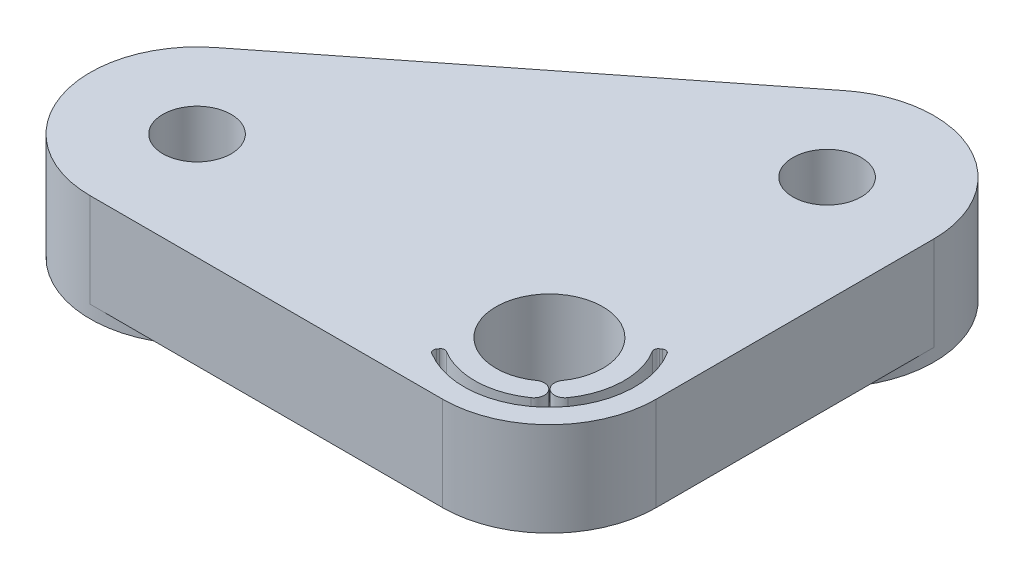
ISO-10303-21;
HEADER;
FILE_DESCRIPTION(('STEP AP214'),'2;1');
FILE_NAME('part.step','',(''),(''),'','','');
FILE_SCHEMA(('AUTOMOTIVE_DESIGN { 1 0 10303 214 1 1 1 1 }'));
ENDSEC;
DATA;
#1=APPLICATION_CONTEXT('core data for automotive mechanical design processes');
#2=APPLICATION_PROTOCOL_DEFINITION('international standard','automotive_design',2000,#1);
#3=PRODUCT_CONTEXT('',#1,'mechanical');
#4=PRODUCT('Part','Part','',(#3));
#5=PRODUCT_RELATED_PRODUCT_CATEGORY('part','',(#4));
#6=PRODUCT_DEFINITION_FORMATION('','',#4);
#7=PRODUCT_DEFINITION_CONTEXT('part definition',#1,'design');
#8=PRODUCT_DEFINITION('design','',#6,#7);
#9=PRODUCT_DEFINITION_SHAPE('','',#8);
#10=(LENGTH_UNIT() NAMED_UNIT(*) SI_UNIT(.MILLI.,.METRE.));
#11=(NAMED_UNIT(*) PLANE_ANGLE_UNIT() SI_UNIT($,.RADIAN.));
#12=(NAMED_UNIT(*) SI_UNIT($,.STERADIAN.) SOLID_ANGLE_UNIT());
#13=UNCERTAINTY_MEASURE_WITH_UNIT(LENGTH_MEASURE(1.E-05),#10,'distance_accuracy_value','');
#14=(GEOMETRIC_REPRESENTATION_CONTEXT(3) GLOBAL_UNCERTAINTY_ASSIGNED_CONTEXT((#13)) GLOBAL_UNIT_ASSIGNED_CONTEXT((#10,
#11,#12)) REPRESENTATION_CONTEXT('',''));
#15=CARTESIAN_POINT('',(0.,0.,0.));
#16=DIRECTION('',(0.,0.,1.));
#17=DIRECTION('',(1.,0.,0.));
#18=AXIS2_PLACEMENT_3D('',#15,#16,#17);
#19=CARTESIAN_POINT('',(-10.,0.,0.));
#20=DIRECTION('',(0.,1.,0.));
#21=DIRECTION('',(0.,0.,1.));
#22=AXIS2_PLACEMENT_3D('',#19,#20,#21);
#23=PLANE('',#22);
#24=CARTESIAN_POINT('',(-10.,0.,-13.));
#25=DIRECTION('',(0.,1.,0.));
#26=DIRECTION('',(0.,0.,-1.));
#27=AXIS2_PLACEMENT_3D('',#24,#25,#26);
#28=CIRCLE('',#27,4.99999999999996);
#29=CARTESIAN_POINT('',(-13.0943611330175,0.,-16.9274583611376));
#30=VERTEX_POINT('',#29);
#31=CARTESIAN_POINT('',(-5.,0.,-13.));
#32=VERTEX_POINT('',#31);
#33=EDGE_CURVE('E263',#30,#32,#28,.T.);
#34=ORIENTED_EDGE('',*,*,#33,.T.);
#35=DIRECTION('',(0.,0.,1.));
#36=VECTOR('',#35,1.);
#37=CARTESIAN_POINT('',(-5.,0.,-23.3048337992727));
#38=LINE('',#37,#36);
#39=CARTESIAN_POINT('',(-5.,0.,0.));
#40=VERTEX_POINT('',#39);
#41=EDGE_CURVE('E302',#32,#40,#38,.T.);
#42=ORIENTED_EDGE('',*,*,#41,.T.);
#43=CARTESIAN_POINT('',(-10.,0.,0.));
#44=DIRECTION('',(0.,-1.,0.));
#45=DIRECTION('',(0.,0.,1.));
#46=AXIS2_PLACEMENT_3D('',#43,#44,#45);
#47=CIRCLE('',#46,5.);
#48=CARTESIAN_POINT('',(-10.,0.,5.));
#49=VERTEX_POINT('',#48);
#50=EDGE_CURVE('E315',#49,#40,#47,.F.);
#51=ORIENTED_EDGE('',*,*,#50,.F.);
#52=DIRECTION('',(-1.,0.,0.));
#53=VECTOR('',#52,1.);
#54=CARTESIAN_POINT('',(-5.,0.,5.));
#55=LINE('',#54,#53);
#56=CARTESIAN_POINT('',(-26.5,0.,5.));
#57=VERTEX_POINT('',#56);
#58=EDGE_CURVE('E305',#49,#57,#55,.T.);
#59=ORIENTED_EDGE('',*,*,#58,.T.);
#60=CARTESIAN_POINT('',(-26.5,0.,0.));
#61=DIRECTION('',(0.,1.,0.));
#62=DIRECTION('',(0.,0.,-1.));
#63=AXIS2_PLACEMENT_3D('',#60,#61,#62);
#64=CIRCLE('',#63,5.00000000000015);
#65=CARTESIAN_POINT('',(-29.5943611330177,0.,-3.92745836113779));
#66=VERTEX_POINT('',#65);
#67=EDGE_CURVE('E11',#57,#66,#64,.T.);
#68=ORIENTED_EDGE('',*,*,#67,.T.);
#69=DIRECTION('',(0.785491672227536,0.,-0.618872226603513));
#70=VECTOR('',#69,1.);
#71=CARTESIAN_POINT('',(-40.925365976,0.,5.));
#72=LINE('',#71,#70);
#73=EDGE_CURVE('E308',#66,#30,#72,.T.);
#74=ORIENTED_EDGE('',*,*,#73,.T.);
#75=EDGE_LOOP('',(#34,#42,#51,#59,#68,#74));
#76=FACE_BOUND('',#75,.T.);
#77=CARTESIAN_POINT('',(-10.,0.,0.));
#78=DIRECTION('',(0.,-1.,0.));
#79=DIRECTION('',(0.,0.,1.));
#80=AXIS2_PLACEMENT_3D('',#77,#78,#79);
#81=CIRCLE('',#80,3.5);
#82=CARTESIAN_POINT('',(-11.8496078474324,0.,2.97135504622326));
#83=VERTEX_POINT('',#82);
#84=CARTESIAN_POINT('',(-7.99248247277131,0.,2.86703215501145));
#85=VERTEX_POINT('',#84);
#86=EDGE_CURVE('E254',#83,#85,#81,.F.);
#87=ORIENTED_EDGE('',*,*,#86,.F.);
#88=CARTESIAN_POINT('',(-11.9552997244286,0.,3.1411467631503));
#89=DIRECTION('',(0.,-1.,0.));
#90=DIRECTION('',(0.,0.,1.));
#91=AXIS2_PLACEMENT_3D('',#88,#89,#90);
#92=CIRCLE('',#91,0.2);
#93=CARTESIAN_POINT('',(-12.1191301332864,0.,3.0264314758801));
#94=VERTEX_POINT('',#93);
#95=EDGE_CURVE('E251',#94,#83,#92,.T.);
#96=ORIENTED_EDGE('',*,*,#95,.F.);
#97=DIRECTION('',(0.573576436351049,0.,-0.81915204428899));
#98=VECTOR('',#97,1.);
#99=CARTESIAN_POINT('',(-9.99999999999997,0.,0.));
#100=LINE('',#99,#98);
#101=CARTESIAN_POINT('',(-12.1765695412863,0.,3.10846345192362));
#102=VERTEX_POINT('',#101);
#103=EDGE_CURVE('E248',#102,#94,#100,.T.);
#104=ORIENTED_EDGE('',*,*,#103,.F.);
#105=CARTESIAN_POINT('',(-12.0127391324285,0.,3.22317873919383));
#106=DIRECTION('',(0.,-1.,0.));
#107=DIRECTION('',(0.,0.,1.));
#108=AXIS2_PLACEMENT_3D('',#105,#106,#107);
#109=CIRCLE('',#108,0.2);
#110=CARTESIAN_POINT('',(-12.1186727709773,0.,3.39281972546719));
#111=VERTEX_POINT('',#110);
#112=EDGE_CURVE('E245',#111,#102,#109,.T.);
#113=ORIENTED_EDGE('',*,*,#112,.F.);
#114=CARTESIAN_POINT('',(-10.,0.,0.));
#115=DIRECTION('',(0.,-1.,0.));
#116=DIRECTION('',(0.,0.,1.));
#117=AXIS2_PLACEMENT_3D('',#114,#115,#116);
#118=CIRCLE('',#117,4.);
#119=CARTESIAN_POINT('',(-6.60718027453282,0.,-2.11867277097734));
#120=VERTEX_POINT('',#119);
#121=EDGE_CURVE('E242',#120,#111,#118,.T.);
#122=ORIENTED_EDGE('',*,*,#121,.F.);
#123=CARTESIAN_POINT('',(-6.77682126080618,0.,-2.01273913242848));
#124=DIRECTION('',(0.,-1.,0.));
#125=DIRECTION('',(0.,0.,1.));
#126=AXIS2_PLACEMENT_3D('',#123,#124,#125);
#127=CIRCLE('',#126,0.199999999999999);
#128=CARTESIAN_POINT('',(-6.89153654807639,0.,-2.17656954128628));
#129=VERTEX_POINT('',#128);
#130=EDGE_CURVE('E239',#129,#120,#127,.T.);
#131=ORIENTED_EDGE('',*,*,#130,.F.);
#132=DIRECTION('',(0.81915204428899,0.,-0.573576436351048));
#133=VECTOR('',#132,1.);
#134=CARTESIAN_POINT('',(-9.99999999999999,0.,0.));
#135=LINE('',#134,#133);
#136=CARTESIAN_POINT('',(-6.97356852411991,0.,-2.11913013328636));
#137=VERTEX_POINT('',#136);
#138=EDGE_CURVE('E236',#137,#129,#135,.T.);
#139=ORIENTED_EDGE('',*,*,#138,.F.);
#140=CARTESIAN_POINT('',(-6.85885323684971,0.,-1.95529972442856));
#141=DIRECTION('',(0.,-1.,0.));
#142=DIRECTION('',(0.,0.,1.));
#143=AXIS2_PLACEMENT_3D('',#140,#141,#142);
#144=CIRCLE('',#143,0.2);
#145=CARTESIAN_POINT('',(-7.02864495377675,0.,-1.84960784743243));
#146=VERTEX_POINT('',#145);
#147=EDGE_CURVE('E233',#146,#137,#144,.T.);
#148=ORIENTED_EDGE('',*,*,#147,.F.);
#149=CARTESIAN_POINT('',(-10.,0.,0.));
#150=DIRECTION('',(0.,-1.,0.));
#151=DIRECTION('',(0.,0.,1.));
#152=AXIS2_PLACEMENT_3D('',#149,#150,#151);
#153=CIRCLE('',#152,3.5);
#154=CARTESIAN_POINT('',(-7.13296784498854,0.,2.00751752722868));
#155=VERTEX_POINT('',#154);
#156=EDGE_CURVE('E231',#155,#146,#153,.F.);
#157=ORIENTED_EDGE('',*,*,#156,.F.);
#158=CARTESIAN_POINT('',(-7.54254386713303,0.,1.72072930905315));
#159=DIRECTION('',(0.,-1.,0.));
#160=DIRECTION('',(0.,0.,1.));
#161=AXIS2_PLACEMENT_3D('',#158,#159,#160);
#162=CIRCLE('',#161,0.5);
#163=CARTESIAN_POINT('',(-7.95211988927753,0.,1.43394109087763));
#164=VERTEX_POINT('',#163);
#165=EDGE_CURVE('E164',#164,#155,#162,.F.);
#166=ORIENTED_EDGE('',*,*,#165,.F.);
#167=CARTESIAN_POINT('',(-10.,0.,0.));
#168=DIRECTION('',(0.,-1.,0.));
#169=DIRECTION('',(0.,0.,1.));
#170=AXIS2_PLACEMENT_3D('',#167,#168,#169);
#171=CIRCLE('',#170,2.5);
#172=CARTESIAN_POINT('',(-8.56605890912237,0.,2.04788011072247));
#173=VERTEX_POINT('',#172);
#174=EDGE_CURVE('E299',#173,#164,#171,.T.);
#175=ORIENTED_EDGE('',*,*,#174,.F.);
#176=CARTESIAN_POINT('',(-8.27927069094684,0.,2.45745613286696));
#177=DIRECTION('',(0.,-1.,0.));
#178=DIRECTION('',(0.,0.,1.));
#179=AXIS2_PLACEMENT_3D('',#176,#177,#178);
#180=CIRCLE('',#179,0.5);
#181=EDGE_CURVE('E257',#85,#173,#180,.F.);
#182=ORIENTED_EDGE('',*,*,#181,.F.);
#183=EDGE_LOOP('',(#87,#96,#104,#113,#122,#131,#139,#148,#157,#166,#175,#182));
#184=FACE_BOUND('',#183,.T.);
#185=ADVANCED_FACE('F35',(#76,#184),#23,.F.);
#186=CARTESIAN_POINT('',(-10.,1.57,0.));
#187=DIRECTION('',(0.,-1.,0.));
#188=DIRECTION('',(0.,0.,-1.));
#189=AXIS2_PLACEMENT_3D('',#186,#187,#188);
#190=CYLINDRICAL_SURFACE('',#189,2.5);
#191=ORIENTED_EDGE('',*,*,#174,.T.);
#192=DIRECTION('',(0.,1.,0.));
#193=VECTOR('',#192,1.);
#194=CARTESIAN_POINT('',(-7.95211988927753,-5.6,1.43394109087763));
#195=LINE('',#194,#193);
#196=CARTESIAN_POINT('',(-7.95211988927753,4.4,1.43394109087762));
#197=VERTEX_POINT('',#196);
#198=EDGE_CURVE('E169',#164,#197,#195,.T.);
#199=ORIENTED_EDGE('',*,*,#198,.T.);
#200=CARTESIAN_POINT('',(-10.,4.4,0.));
#201=DIRECTION('',(0.,-1.,0.));
#202=DIRECTION('',(0.,0.,1.));
#203=AXIS2_PLACEMENT_3D('',#200,#201,#202);
#204=CIRCLE('',#203,2.5);
#205=CARTESIAN_POINT('',(-8.56605890912237,4.4,2.04788011072247));
#206=VERTEX_POINT('',#205);
#207=EDGE_CURVE('E181',#206,#197,#204,.T.);
#208=ORIENTED_EDGE('',*,*,#207,.F.);
#209=DIRECTION('',(0.,1.,0.));
#210=VECTOR('',#209,1.);
#211=CARTESIAN_POINT('',(-8.56605890912237,-5.6,2.04788011072247));
#212=LINE('',#211,#210);
#213=EDGE_CURVE('E209',#173,#206,#212,.T.);
#214=ORIENTED_EDGE('',*,*,#213,.F.);
#215=EDGE_LOOP('',(#191,#199,#208,#214));
#216=FACE_BOUND('',#215,.T.);
#217=ADVANCED_FACE('F373',(#216),#190,.F.);
#218=CARTESIAN_POINT('',(-26.5,4.4,0.));
#219=DIRECTION('',(0.,1.,0.));
#220=DIRECTION('',(0.,0.,1.));
#221=AXIS2_PLACEMENT_3D('',#218,#219,#220);
#222=PLANE('',#221);
#223=CARTESIAN_POINT('',(-10.,4.4,-13.));
#224=DIRECTION('',(0.,-1.,0.));
#225=DIRECTION('',(0.,0.,1.));
#226=AXIS2_PLACEMENT_3D('',#223,#224,#225);
#227=CIRCLE('',#226,1.6);
#228=CARTESIAN_POINT('',(-10.,4.4,-11.4));
#229=VERTEX_POINT('',#228);
#230=EDGE_CURVE('E274',#229,#229,#227,.T.);
#231=ORIENTED_EDGE('',*,*,#230,.T.);
#232=EDGE_LOOP('',(#231));
#233=FACE_BOUND('',#232,.T.);
#234=CARTESIAN_POINT('',(-26.5,4.4,0.));
#235=DIRECTION('',(0.,-1.,0.));
#236=DIRECTION('',(0.,0.,1.));
#237=AXIS2_PLACEMENT_3D('',#234,#235,#236);
#238=CIRCLE('',#237,5.);
#239=CARTESIAN_POINT('',(-26.5,4.4,5.));
#240=VERTEX_POINT('',#239);
#241=CARTESIAN_POINT('',(-29.5943611330176,4.4,-3.92745836113767));
#242=VERTEX_POINT('',#241);
#243=EDGE_CURVE('E282',#240,#242,#238,.T.);
#244=ORIENTED_EDGE('',*,*,#243,.F.);
#245=DIRECTION('',(-1.,0.,0.));
#246=VECTOR('',#245,1.);
#247=CARTESIAN_POINT('',(-10.,4.4,5.));
#248=LINE('',#247,#246);
#249=CARTESIAN_POINT('',(-10.,4.4,5.));
#250=VERTEX_POINT('',#249);
#251=EDGE_CURVE('E297',#250,#240,#248,.T.);
#252=ORIENTED_EDGE('',*,*,#251,.F.);
#253=CARTESIAN_POINT('',(-10.,4.4,0.));
#254=DIRECTION('',(0.,-1.,0.));
#255=DIRECTION('',(0.,0.,1.));
#256=AXIS2_PLACEMENT_3D('',#253,#254,#255);
#257=CIRCLE('',#256,5.);
#258=CARTESIAN_POINT('',(-5.,4.4,0.));
#259=VERTEX_POINT('',#258);
#260=EDGE_CURVE('E294',#259,#250,#257,.T.);
#261=ORIENTED_EDGE('',*,*,#260,.F.);
#262=DIRECTION('',(0.,0.,1.));
#263=VECTOR('',#262,1.);
#264=CARTESIAN_POINT('',(-5.,4.4,-13.));
#265=LINE('',#264,#263);
#266=CARTESIAN_POINT('',(-5.,4.4,-13.));
#267=VERTEX_POINT('',#266);
#268=EDGE_CURVE('E291',#267,#259,#265,.T.);
#269=ORIENTED_EDGE('',*,*,#268,.F.);
#270=CARTESIAN_POINT('',(-10.,4.4,-13.));
#271=DIRECTION('',(0.,-1.,0.));
#272=DIRECTION('',(0.,0.,1.));
#273=AXIS2_PLACEMENT_3D('',#270,#271,#272);
#274=CIRCLE('',#273,5.);
#275=CARTESIAN_POINT('',(-13.0943611330176,4.4,-16.9274583611377));
#276=VERTEX_POINT('',#275);
#277=EDGE_CURVE('E288',#276,#267,#274,.T.);
#278=ORIENTED_EDGE('',*,*,#277,.F.);
#279=DIRECTION('',(0.785491672227536,0.,-0.618872226603513));
#280=VECTOR('',#279,1.);
#281=CARTESIAN_POINT('',(-29.5943611330176,4.4,-3.92745836113767));
#282=LINE('',#281,#280);
#283=EDGE_CURVE('E285',#242,#276,#282,.T.);
#284=ORIENTED_EDGE('',*,*,#283,.F.);
#285=EDGE_LOOP('',(#244,#252,#261,#269,#278,#284));
#286=FACE_BOUND('',#285,.T.);
#287=CARTESIAN_POINT('',(-26.5,4.4,0.));
#288=DIRECTION('',(0.,-1.,0.));
#289=DIRECTION('',(0.,0.,1.));
#290=AXIS2_PLACEMENT_3D('',#287,#288,#289);
#291=CIRCLE('',#290,1.60000000000012);
#292=CARTESIAN_POINT('',(-26.5,4.4,1.60000000000012));
#293=VERTEX_POINT('',#292);
#294=EDGE_CURVE('E278',#293,#293,#291,.T.);
#295=ORIENTED_EDGE('',*,*,#294,.T.);
#296=EDGE_LOOP('',(#295));
#297=FACE_BOUND('',#296,.T.);
#298=CARTESIAN_POINT('',(-8.27927069094684,4.4,2.45745613286696));
#299=DIRECTION('',(0.,1.,0.));
#300=DIRECTION('',(0.,0.,1.));
#301=AXIS2_PLACEMENT_3D('',#298,#299,#300);
#302=CIRCLE('',#301,0.5);
#303=CARTESIAN_POINT('',(-7.99248247277131,4.4,2.86703215501145));
#304=VERTEX_POINT('',#303);
#305=EDGE_CURVE('E207',#304,#206,#302,.T.);
#306=ORIENTED_EDGE('',*,*,#305,.T.);
#307=ORIENTED_EDGE('',*,*,#207,.T.);
#308=CARTESIAN_POINT('',(-7.54254386713303,4.4,1.72072930905315));
#309=DIRECTION('',(0.,1.,0.));
#310=DIRECTION('',(0.,0.,-1.));
#311=AXIS2_PLACEMENT_3D('',#308,#309,#310);
#312=CIRCLE('',#311,0.5);
#313=CARTESIAN_POINT('',(-7.13296784498854,4.4,2.00751752722868));
#314=VERTEX_POINT('',#313);
#315=EDGE_CURVE('E51',#197,#314,#312,.T.);
#316=ORIENTED_EDGE('',*,*,#315,.T.);
#317=CARTESIAN_POINT('',(-10.,4.4,0.));
#318=DIRECTION('',(0.,1.,0.));
#319=DIRECTION('',(0.,0.,-1.));
#320=AXIS2_PLACEMENT_3D('',#317,#318,#319);
#321=CIRCLE('',#320,3.5);
#322=CARTESIAN_POINT('',(-7.02864495377675,4.4,-1.84960784743243));
#323=VERTEX_POINT('',#322);
#324=EDGE_CURVE('E172',#314,#323,#321,.T.);
#325=ORIENTED_EDGE('',*,*,#324,.T.);
#326=CARTESIAN_POINT('',(-6.85885323684971,4.4,-1.95529972442856));
#327=DIRECTION('',(0.,-1.,0.));
#328=DIRECTION('',(0.,0.,-1.));
#329=AXIS2_PLACEMENT_3D('',#326,#327,#328);
#330=CIRCLE('',#329,0.2);
#331=CARTESIAN_POINT('',(-6.97356852411991,4.4,-2.11913013328636));
#332=VERTEX_POINT('',#331);
#333=EDGE_CURVE('E177',#323,#332,#330,.T.);
#334=ORIENTED_EDGE('',*,*,#333,.T.);
#335=DIRECTION('',(0.81915204428899,0.,-0.573576436351048));
#336=VECTOR('',#335,1.);
#337=CARTESIAN_POINT('',(-6.97356852411991,4.4,-2.11913013328636));
#338=LINE('',#337,#336);
#339=CARTESIAN_POINT('',(-6.89153654807639,4.4,-2.17656954128628));
#340=VERTEX_POINT('',#339);
#341=EDGE_CURVE('E186',#332,#340,#338,.T.);
#342=ORIENTED_EDGE('',*,*,#341,.T.);
#343=CARTESIAN_POINT('',(-6.77682126080618,4.4,-2.01273913242848));
#344=DIRECTION('',(0.,-1.,0.));
#345=DIRECTION('',(0.,0.,1.));
#346=AXIS2_PLACEMENT_3D('',#343,#344,#345);
#347=CIRCLE('',#346,0.199999999999999);
#348=CARTESIAN_POINT('',(-6.60718027453282,4.4,-2.11867277097734));
#349=VERTEX_POINT('',#348);
#350=EDGE_CURVE('E189',#340,#349,#347,.T.);
#351=ORIENTED_EDGE('',*,*,#350,.T.);
#352=CARTESIAN_POINT('',(-10.,4.4,0.));
#353=DIRECTION('',(0.,-1.,0.));
#354=DIRECTION('',(0.,0.,-1.));
#355=AXIS2_PLACEMENT_3D('',#352,#353,#354);
#356=CIRCLE('',#355,4.);
#357=CARTESIAN_POINT('',(-12.1186727709773,4.4,3.39281972546719));
#358=VERTEX_POINT('',#357);
#359=EDGE_CURVE('E192',#349,#358,#356,.T.);
#360=ORIENTED_EDGE('',*,*,#359,.T.);
#361=CARTESIAN_POINT('',(-12.0127391324285,4.4,3.22317873919383));
#362=DIRECTION('',(0.,-1.,0.));
#363=DIRECTION('',(0.,0.,-1.));
#364=AXIS2_PLACEMENT_3D('',#361,#362,#363);
#365=CIRCLE('',#364,0.2);
#366=CARTESIAN_POINT('',(-12.1765695412863,4.4,3.10846345192362));
#367=VERTEX_POINT('',#366);
#368=EDGE_CURVE('E195',#358,#367,#365,.T.);
#369=ORIENTED_EDGE('',*,*,#368,.T.);
#370=DIRECTION('',(0.573576436351049,0.,-0.81915204428899));
#371=VECTOR('',#370,1.);
#372=CARTESIAN_POINT('',(-12.1191301332864,4.4,3.0264314758801));
#373=LINE('',#372,#371);
#374=CARTESIAN_POINT('',(-12.1191301332864,4.4,3.0264314758801));
#375=VERTEX_POINT('',#374);
#376=EDGE_CURVE('E198',#367,#375,#373,.T.);
#377=ORIENTED_EDGE('',*,*,#376,.T.);
#378=CARTESIAN_POINT('',(-11.9552997244286,4.4,3.1411467631503));
#379=DIRECTION('',(0.,-1.,0.));
#380=DIRECTION('',(0.,0.,1.));
#381=AXIS2_PLACEMENT_3D('',#378,#379,#380);
#382=CIRCLE('',#381,0.2);
#383=CARTESIAN_POINT('',(-11.8496078474324,4.4,2.97135504622326));
#384=VERTEX_POINT('',#383);
#385=EDGE_CURVE('E201',#375,#384,#382,.T.);
#386=ORIENTED_EDGE('',*,*,#385,.T.);
#387=CARTESIAN_POINT('',(-10.,4.4,0.));
#388=DIRECTION('',(0.,1.,0.));
#389=DIRECTION('',(0.,0.,1.));
#390=AXIS2_PLACEMENT_3D('',#387,#388,#389);
#391=CIRCLE('',#390,3.5);
#392=EDGE_CURVE('E204',#384,#304,#391,.T.);
#393=ORIENTED_EDGE('',*,*,#392,.T.);
#394=EDGE_LOOP('',(#306,#307,#316,#325,#334,#342,#351,#360,#369,#377,#386,#393));
#395=FACE_BOUND('',#394,.T.);
#396=ADVANCED_FACE('F179',(#233,#286,#297,#395),#222,.T.);
#397=CARTESIAN_POINT('',(-5.,1.57,-23.3048337992727));
#398=DIRECTION('',(-1.,0.,0.));
#399=DIRECTION('',(0.,0.,-1.));
#400=AXIS2_PLACEMENT_3D('',#397,#398,#399);
#401=PLANE('',#400);
#402=DIRECTION('',(0.,-1.,0.));
#403=VECTOR('',#402,1.);
#404=CARTESIAN_POINT('',(-5.,1.57,0.));
#405=LINE('',#404,#403);
#406=EDGE_CURVE('E311',#40,#259,#405,.F.);
#407=ORIENTED_EDGE('',*,*,#406,.F.);
#408=ORIENTED_EDGE('',*,*,#41,.F.);
#409=DIRECTION('',(0.,-1.,0.));
#410=VECTOR('',#409,1.);
#411=CARTESIAN_POINT('',(-5.,1.57,-13.));
#412=LINE('',#411,#410);
#413=EDGE_CURVE('E313',#267,#32,#412,.T.);
#414=ORIENTED_EDGE('',*,*,#413,.F.);
#415=ORIENTED_EDGE('',*,*,#268,.T.);
#416=EDGE_LOOP('',(#407,#408,#414,#415));
#417=FACE_BOUND('',#416,.T.);
#418=ADVANCED_FACE('F333',(#417),#401,.F.);
#419=CARTESIAN_POINT('',(-5.,1.57,5.));
#420=DIRECTION('',(0.,0.,-1.));
#421=DIRECTION('',(1.,0.,0.));
#422=AXIS2_PLACEMENT_3D('',#419,#420,#421);
#423=PLANE('',#422);
#424=DIRECTION('',(0.,-1.,0.));
#425=VECTOR('',#424,1.);
#426=CARTESIAN_POINT('',(-26.5,1.57,5.));
#427=LINE('',#426,#425);
#428=EDGE_CURVE('E59',#57,#240,#427,.F.);
#429=ORIENTED_EDGE('',*,*,#428,.F.);
#430=ORIENTED_EDGE('',*,*,#58,.F.);
#431=DIRECTION('',(0.,-1.,0.));
#432=VECTOR('',#431,1.);
#433=CARTESIAN_POINT('',(-10.,1.57,5.));
#434=LINE('',#433,#432);
#435=EDGE_CURVE('E39',#250,#49,#434,.T.);
#436=ORIENTED_EDGE('',*,*,#435,.F.);
#437=ORIENTED_EDGE('',*,*,#251,.T.);
#438=EDGE_LOOP('',(#429,#430,#436,#437));
#439=FACE_BOUND('',#438,.T.);
#440=ADVANCED_FACE('F327',(#439),#423,.F.);
#441=CARTESIAN_POINT('',(-40.925365976,1.57,5.));
#442=DIRECTION('',(0.618872226603513,0.,0.785491672227536));
#443=DIRECTION('',(-0.785491672227536,0.,0.618872226603513));
#444=AXIS2_PLACEMENT_3D('',#441,#442,#443);
#445=PLANE('',#444);
#446=ORIENTED_EDGE('',*,*,#73,.F.);
#447=DIRECTION('',(0.,-1.,0.));
#448=VECTOR('',#447,1.);
#449=CARTESIAN_POINT('',(-29.5943611330176,1.57,-3.92745836113768));
#450=LINE('',#449,#448);
#451=EDGE_CURVE('E318',#242,#66,#450,.T.);
#452=ORIENTED_EDGE('',*,*,#451,.F.);
#453=ORIENTED_EDGE('',*,*,#283,.T.);
#454=DIRECTION('',(0.,-1.,0.));
#455=VECTOR('',#454,1.);
#456=CARTESIAN_POINT('',(-13.0943611330176,1.57,-16.9274583611377));
#457=LINE('',#456,#455);
#458=EDGE_CURVE('E320',#30,#276,#457,.F.);
#459=ORIENTED_EDGE('',*,*,#458,.F.);
#460=EDGE_LOOP('',(#446,#452,#453,#459));
#461=FACE_BOUND('',#460,.T.);
#462=ADVANCED_FACE('F343',(#461),#445,.F.);
#463=CARTESIAN_POINT('',(-26.5,1.57,0.));
#464=DIRECTION('',(0.,-1.,0.));
#465=DIRECTION('',(0.,0.,-1.));
#466=AXIS2_PLACEMENT_3D('',#463,#464,#465);
#467=CYLINDRICAL_SURFACE('',#466,1.6);
#468=ORIENTED_EDGE('',*,*,#294,.F.);
#469=EDGE_LOOP('',(#468));
#470=FACE_BOUND('',#469,.T.);
#471=CARTESIAN_POINT('',(-26.5,-0.6,0.));
#472=DIRECTION('',(0.,1.,0.));
#473=DIRECTION('',(0.,0.,-1.));
#474=AXIS2_PLACEMENT_3D('',#471,#472,#473);
#475=CIRCLE('',#474,1.60000000000012);
#476=CARTESIAN_POINT('',(-26.5,-0.6,-1.60000000000012));
#477=VERTEX_POINT('',#476);
#478=EDGE_CURVE('E267',#477,#477,#475,.T.);
#479=ORIENTED_EDGE('',*,*,#478,.F.);
#480=EDGE_LOOP('',(#479));
#481=FACE_BOUND('',#480,.T.);
#482=ADVANCED_FACE('F361',(#470,#481),#467,.F.);
#483=CARTESIAN_POINT('',(-10.,1.57,-13.));
#484=DIRECTION('',(0.,-1.,0.));
#485=DIRECTION('',(0.,0.,-1.));
#486=AXIS2_PLACEMENT_3D('',#483,#484,#485);
#487=CYLINDRICAL_SURFACE('',#486,1.6);
#488=ORIENTED_EDGE('',*,*,#230,.F.);
#489=EDGE_LOOP('',(#488));
#490=FACE_BOUND('',#489,.T.);
#491=CARTESIAN_POINT('',(-10.,-0.6,-13.));
#492=DIRECTION('',(0.,1.,0.));
#493=DIRECTION('',(0.,0.,-1.));
#494=AXIS2_PLACEMENT_3D('',#491,#492,#493);
#495=CIRCLE('',#494,1.6);
#496=CARTESIAN_POINT('',(-10.,-0.6,-14.6));
#497=VERTEX_POINT('',#496);
#498=EDGE_CURVE('E260',#497,#497,#495,.T.);
#499=ORIENTED_EDGE('',*,*,#498,.F.);
#500=EDGE_LOOP('',(#499));
#501=FACE_BOUND('',#500,.T.);
#502=ADVANCED_FACE('F348',(#490,#501),#487,.F.);
#503=CARTESIAN_POINT('',(-10.,1.57,-13.));
#504=DIRECTION('',(0.,-1.,0.));
#505=DIRECTION('',(0.,0.,-1.));
#506=AXIS2_PLACEMENT_3D('',#503,#504,#505);
#507=CYLINDRICAL_SURFACE('',#506,5.);
#508=ORIENTED_EDGE('',*,*,#413,.T.);
#509=ORIENTED_EDGE('',*,*,#33,.F.);
#510=ORIENTED_EDGE('',*,*,#458,.T.);
#511=ORIENTED_EDGE('',*,*,#277,.T.);
#512=EDGE_LOOP('',(#508,#509,#510,#511));
#513=FACE_BOUND('',#512,.T.);
#514=CARTESIAN_POINT('',(-10.,-0.6,-13.));
#515=DIRECTION('',(0.,1.,0.));
#516=DIRECTION('',(0.,0.,-1.));
#517=AXIS2_PLACEMENT_3D('',#514,#515,#516);
#518=CIRCLE('',#517,4.99999999999996);
#519=CARTESIAN_POINT('',(-10.,-0.6,-18.));
#520=VERTEX_POINT('',#519);
#521=EDGE_CURVE('E264',#520,#520,#518,.T.);
#522=ORIENTED_EDGE('',*,*,#521,.T.);
#523=EDGE_LOOP('',(#522));
#524=FACE_BOUND('',#523,.T.);
#525=ADVANCED_FACE('F345',(#513,#524),#507,.T.);
#526=CARTESIAN_POINT('',(-10.,1.57,0.));
#527=DIRECTION('',(0.,-1.,0.));
#528=DIRECTION('',(0.,0.,-1.));
#529=AXIS2_PLACEMENT_3D('',#526,#527,#528);
#530=CYLINDRICAL_SURFACE('',#529,5.);
#531=ORIENTED_EDGE('',*,*,#435,.T.);
#532=ORIENTED_EDGE('',*,*,#50,.T.);
#533=ORIENTED_EDGE('',*,*,#406,.T.);
#534=ORIENTED_EDGE('',*,*,#260,.T.);
#535=EDGE_LOOP('',(#531,#532,#533,#534));
#536=FACE_BOUND('',#535,.T.);
#537=ADVANCED_FACE('F323',(#536),#530,.T.);
#538=CARTESIAN_POINT('',(-26.5,1.57,0.));
#539=DIRECTION('',(0.,-1.,0.));
#540=DIRECTION('',(0.,0.,-1.));
#541=AXIS2_PLACEMENT_3D('',#538,#539,#540);
#542=CYLINDRICAL_SURFACE('',#541,5.);
#543=ORIENTED_EDGE('',*,*,#451,.T.);
#544=ORIENTED_EDGE('',*,*,#67,.F.);
#545=ORIENTED_EDGE('',*,*,#428,.T.);
#546=ORIENTED_EDGE('',*,*,#243,.T.);
#547=EDGE_LOOP('',(#543,#544,#545,#546));
#548=FACE_BOUND('',#547,.T.);
#549=CARTESIAN_POINT('',(-26.5,-0.6,0.));
#550=DIRECTION('',(0.,1.,0.));
#551=DIRECTION('',(0.,0.,-1.));
#552=AXIS2_PLACEMENT_3D('',#549,#550,#551);
#553=CIRCLE('',#552,5.00000000000015);
#554=CARTESIAN_POINT('',(-26.5,-0.6,-5.00000000000015));
#555=VERTEX_POINT('',#554);
#556=EDGE_CURVE('E272',#555,#555,#553,.T.);
#557=ORIENTED_EDGE('',*,*,#556,.T.);
#558=EDGE_LOOP('',(#557));
#559=FACE_BOUND('',#558,.T.);
#560=ADVANCED_FACE('F37',(#548,#559),#542,.T.);
#561=CARTESIAN_POINT('',(-26.5,-0.6,0.));
#562=DIRECTION('',(0.,-1.,0.));
#563=DIRECTION('',(0.,0.,-1.));
#564=AXIS2_PLACEMENT_3D('',#561,#562,#563);
#565=PLANE('',#564);
#566=ORIENTED_EDGE('',*,*,#556,.F.);
#567=EDGE_LOOP('',(#566));
#568=FACE_BOUND('',#567,.T.);
#569=ORIENTED_EDGE('',*,*,#478,.T.);
#570=EDGE_LOOP('',(#569));
#571=FACE_BOUND('',#570,.T.);
#572=ADVANCED_FACE('F356',(#568,#571),#565,.T.);
#573=CARTESIAN_POINT('',(-10.,-0.6,-13.));
#574=DIRECTION('',(0.,-1.,0.));
#575=DIRECTION('',(0.,0.,-1.));
#576=AXIS2_PLACEMENT_3D('',#573,#574,#575);
#577=PLANE('',#576);
#578=ORIENTED_EDGE('',*,*,#521,.F.);
#579=EDGE_LOOP('',(#578));
#580=FACE_BOUND('',#579,.T.);
#581=ORIENTED_EDGE('',*,*,#498,.T.);
#582=EDGE_LOOP('',(#581));
#583=FACE_BOUND('',#582,.T.);
#584=ADVANCED_FACE('F352',(#580,#583),#577,.T.);
#585=CARTESIAN_POINT('',(-8.27927069094684,-5.6,2.45745613286696));
#586=DIRECTION('',(0.,1.,0.));
#587=DIRECTION('',(0.,0.,1.));
#588=AXIS2_PLACEMENT_3D('',#585,#586,#587);
#589=CYLINDRICAL_SURFACE('',#588,0.5);
#590=DIRECTION('',(0.,1.,0.));
#591=VECTOR('',#590,1.);
#592=CARTESIAN_POINT('',(-7.99248247277131,-5.6,2.86703215501145));
#593=LINE('',#592,#591);
#594=EDGE_CURVE('E212',#85,#304,#593,.T.);
#595=ORIENTED_EDGE('',*,*,#594,.F.);
#596=ORIENTED_EDGE('',*,*,#181,.T.);
#597=ORIENTED_EDGE('',*,*,#213,.T.);
#598=ORIENTED_EDGE('',*,*,#305,.F.);
#599=EDGE_LOOP('',(#595,#596,#597,#598));
#600=FACE_BOUND('',#599,.T.);
#601=ADVANCED_FACE('F355',(#600),#589,.T.);
#602=CARTESIAN_POINT('',(-10.,-5.6,0.));
#603=DIRECTION('',(0.,1.,0.));
#604=DIRECTION('',(0.,0.,1.));
#605=AXIS2_PLACEMENT_3D('',#602,#603,#604);
#606=CYLINDRICAL_SURFACE('',#605,3.5);
#607=DIRECTION('',(0.,1.,0.));
#608=VECTOR('',#607,1.);
#609=CARTESIAN_POINT('',(-11.8496078474324,-5.6,2.97135504622326));
#610=LINE('',#609,#608);
#611=EDGE_CURVE('E214',#83,#384,#610,.T.);
#612=ORIENTED_EDGE('',*,*,#611,.F.);
#613=ORIENTED_EDGE('',*,*,#86,.T.);
#614=ORIENTED_EDGE('',*,*,#594,.T.);
#615=ORIENTED_EDGE('',*,*,#392,.F.);
#616=EDGE_LOOP('',(#612,#613,#614,#615));
#617=FACE_BOUND('',#616,.T.);
#618=ADVANCED_FACE('F466',(#617),#606,.T.);
#619=CARTESIAN_POINT('',(-11.9552997244286,-5.6,3.1411467631503));
#620=DIRECTION('',(0.,1.,0.));
#621=DIRECTION('',(0.,0.,1.));
#622=AXIS2_PLACEMENT_3D('',#619,#620,#621);
#623=CYLINDRICAL_SURFACE('',#622,0.2);
#624=DIRECTION('',(0.,1.,0.));
#625=VECTOR('',#624,1.);
#626=CARTESIAN_POINT('',(-12.1191301332864,-5.6,3.0264314758801));
#627=LINE('',#626,#625);
#628=EDGE_CURVE('E216',#94,#375,#627,.T.);
#629=ORIENTED_EDGE('',*,*,#628,.F.);
#630=ORIENTED_EDGE('',*,*,#95,.T.);
#631=ORIENTED_EDGE('',*,*,#611,.T.);
#632=ORIENTED_EDGE('',*,*,#385,.F.);
#633=EDGE_LOOP('',(#629,#630,#631,#632));
#634=FACE_BOUND('',#633,.T.);
#635=ADVANCED_FACE('F476',(#634),#623,.F.);
#636=CARTESIAN_POINT('',(-12.1191301332864,-5.6,3.0264314758801));
#637=DIRECTION('',(-0.81915204428899,0.,-0.573576436351049));
#638=DIRECTION('',(0.573576436351049,0.,-0.81915204428899));
#639=AXIS2_PLACEMENT_3D('',#636,#637,#638);
#640=PLANE('',#639);
#641=DIRECTION('',(0.,1.,0.));
#642=VECTOR('',#641,1.);
#643=CARTESIAN_POINT('',(-12.1765695412863,-5.6,3.10846345192362));
#644=LINE('',#643,#642);
#645=EDGE_CURVE('E218',#102,#367,#644,.T.);
#646=ORIENTED_EDGE('',*,*,#645,.F.);
#647=ORIENTED_EDGE('',*,*,#103,.T.);
#648=ORIENTED_EDGE('',*,*,#628,.T.);
#649=ORIENTED_EDGE('',*,*,#376,.F.);
#650=EDGE_LOOP('',(#646,#647,#648,#649));
#651=FACE_BOUND('',#650,.T.);
#652=ADVANCED_FACE('F486',(#651),#640,.F.);
#653=CARTESIAN_POINT('',(-12.0127391324285,-5.6,3.22317873919383));
#654=DIRECTION('',(0.,1.,0.));
#655=DIRECTION('',(0.,0.,1.));
#656=AXIS2_PLACEMENT_3D('',#653,#654,#655);
#657=CYLINDRICAL_SURFACE('',#656,0.2);
#658=DIRECTION('',(0.,1.,0.));
#659=VECTOR('',#658,1.);
#660=CARTESIAN_POINT('',(-12.1186727709773,-5.6,3.39281972546719));
#661=LINE('',#660,#659);
#662=EDGE_CURVE('E220',#111,#358,#661,.T.);
#663=ORIENTED_EDGE('',*,*,#662,.F.);
#664=ORIENTED_EDGE('',*,*,#112,.T.);
#665=ORIENTED_EDGE('',*,*,#645,.T.);
#666=ORIENTED_EDGE('',*,*,#368,.F.);
#667=EDGE_LOOP('',(#663,#664,#665,#666));
#668=FACE_BOUND('',#667,.T.);
#669=ADVANCED_FACE('F496',(#668),#657,.F.);
#670=CARTESIAN_POINT('',(-10.,-5.6,0.));
#671=DIRECTION('',(0.,1.,0.));
#672=DIRECTION('',(0.,0.,1.));
#673=AXIS2_PLACEMENT_3D('',#670,#671,#672);
#674=CYLINDRICAL_SURFACE('',#673,4.);
#675=DIRECTION('',(0.,1.,0.));
#676=VECTOR('',#675,1.);
#677=CARTESIAN_POINT('',(-6.60718027453282,-5.6,-2.11867277097734));
#678=LINE('',#677,#676);
#679=EDGE_CURVE('E222',#120,#349,#678,.T.);
#680=ORIENTED_EDGE('',*,*,#679,.F.);
#681=ORIENTED_EDGE('',*,*,#121,.T.);
#682=ORIENTED_EDGE('',*,*,#662,.T.);
#683=ORIENTED_EDGE('',*,*,#359,.F.);
#684=EDGE_LOOP('',(#680,#681,#682,#683));
#685=FACE_BOUND('',#684,.T.);
#686=ADVANCED_FACE('F506',(#685),#674,.F.);
#687=CARTESIAN_POINT('',(-6.77682126080618,-5.6,-2.01273913242848));
#688=DIRECTION('',(0.,1.,0.));
#689=DIRECTION('',(0.,0.,1.));
#690=AXIS2_PLACEMENT_3D('',#687,#688,#689);
#691=CYLINDRICAL_SURFACE('',#690,0.199999999999999);
#692=DIRECTION('',(0.,1.,0.));
#693=VECTOR('',#692,1.);
#694=CARTESIAN_POINT('',(-6.89153654807639,-5.6,-2.17656954128628));
#695=LINE('',#694,#693);
#696=EDGE_CURVE('E224',#129,#340,#695,.T.);
#697=ORIENTED_EDGE('',*,*,#696,.F.);
#698=ORIENTED_EDGE('',*,*,#130,.T.);
#699=ORIENTED_EDGE('',*,*,#679,.T.);
#700=ORIENTED_EDGE('',*,*,#350,.F.);
#701=EDGE_LOOP('',(#697,#698,#699,#700));
#702=FACE_BOUND('',#701,.T.);
#703=ADVANCED_FACE('F516',(#702),#691,.F.);
#704=CARTESIAN_POINT('',(-6.97356852411991,-5.6,-2.11913013328636));
#705=DIRECTION('',(-0.573576436351048,0.,-0.81915204428899));
#706=DIRECTION('',(0.81915204428899,0.,-0.573576436351048));
#707=AXIS2_PLACEMENT_3D('',#704,#705,#706);
#708=PLANE('',#707);
#709=DIRECTION('',(0.,1.,0.));
#710=VECTOR('',#709,1.);
#711=CARTESIAN_POINT('',(-6.97356852411991,-5.6,-2.11913013328636));
#712=LINE('',#711,#710);
#713=EDGE_CURVE('E226',#137,#332,#712,.T.);
#714=ORIENTED_EDGE('',*,*,#713,.F.);
#715=ORIENTED_EDGE('',*,*,#138,.T.);
#716=ORIENTED_EDGE('',*,*,#696,.T.);
#717=ORIENTED_EDGE('',*,*,#341,.F.);
#718=EDGE_LOOP('',(#714,#715,#716,#717));
#719=FACE_BOUND('',#718,.T.);
#720=ADVANCED_FACE('F526',(#719),#708,.F.);
#721=CARTESIAN_POINT('',(-6.85885323684971,-5.6,-1.95529972442856));
#722=DIRECTION('',(0.,1.,0.));
#723=DIRECTION('',(0.,0.,1.));
#724=AXIS2_PLACEMENT_3D('',#721,#722,#723);
#725=CYLINDRICAL_SURFACE('',#724,0.2);
#726=DIRECTION('',(0.,1.,0.));
#727=VECTOR('',#726,1.);
#728=CARTESIAN_POINT('',(-7.02864495377675,-5.6,-1.84960784743243));
#729=LINE('',#728,#727);
#730=EDGE_CURVE('E168',#146,#323,#729,.T.);
#731=ORIENTED_EDGE('',*,*,#730,.F.);
#732=ORIENTED_EDGE('',*,*,#147,.T.);
#733=ORIENTED_EDGE('',*,*,#713,.T.);
#734=ORIENTED_EDGE('',*,*,#333,.F.);
#735=EDGE_LOOP('',(#731,#732,#733,#734));
#736=FACE_BOUND('',#735,.T.);
#737=ADVANCED_FACE('F536',(#736),#725,.F.);
#738=CARTESIAN_POINT('',(-10.,-5.6,0.));
#739=DIRECTION('',(0.,1.,0.));
#740=DIRECTION('',(0.,0.,1.));
#741=AXIS2_PLACEMENT_3D('',#738,#739,#740);
#742=CYLINDRICAL_SURFACE('',#741,3.5);
#743=DIRECTION('',(0.,1.,0.));
#744=VECTOR('',#743,1.);
#745=CARTESIAN_POINT('',(-7.13296784498854,-5.6,2.00751752722868));
#746=LINE('',#745,#744);
#747=EDGE_CURVE('E160',#155,#314,#746,.T.);
#748=ORIENTED_EDGE('',*,*,#747,.F.);
#749=ORIENTED_EDGE('',*,*,#156,.T.);
#750=ORIENTED_EDGE('',*,*,#730,.T.);
#751=ORIENTED_EDGE('',*,*,#324,.F.);
#752=EDGE_LOOP('',(#748,#749,#750,#751));
#753=FACE_BOUND('',#752,.T.);
#754=ADVANCED_FACE('F173',(#753),#742,.T.);
#755=CARTESIAN_POINT('',(-7.54254386713303,-5.6,1.72072930905315));
#756=DIRECTION('',(0.,1.,0.));
#757=DIRECTION('',(0.,0.,1.));
#758=AXIS2_PLACEMENT_3D('',#755,#756,#757);
#759=CYLINDRICAL_SURFACE('',#758,0.5);
#760=ORIENTED_EDGE('',*,*,#198,.F.);
#761=ORIENTED_EDGE('',*,*,#165,.T.);
#762=ORIENTED_EDGE('',*,*,#747,.T.);
#763=ORIENTED_EDGE('',*,*,#315,.F.);
#764=EDGE_LOOP('',(#760,#761,#762,#763));
#765=FACE_BOUND('',#764,.T.);
#766=ADVANCED_FACE('F162',(#765),#759,.T.);
#767=CLOSED_SHELL('',(#185,#217,#396,#418,#440,#462,#482,#502,#525,#537,#560,#572,#584,#601,
#618,#635,#652,#669,#686,#703,#720,#737,#754,#766));
#768=MANIFOLD_SOLID_BREP('B2',#767);
#769=ADVANCED_BREP_SHAPE_REPRESENTATION('',(#18,#768),#14);
#770=SHAPE_DEFINITION_REPRESENTATION(#9,#769);
ENDSEC;
END-ISO-10303-21;
